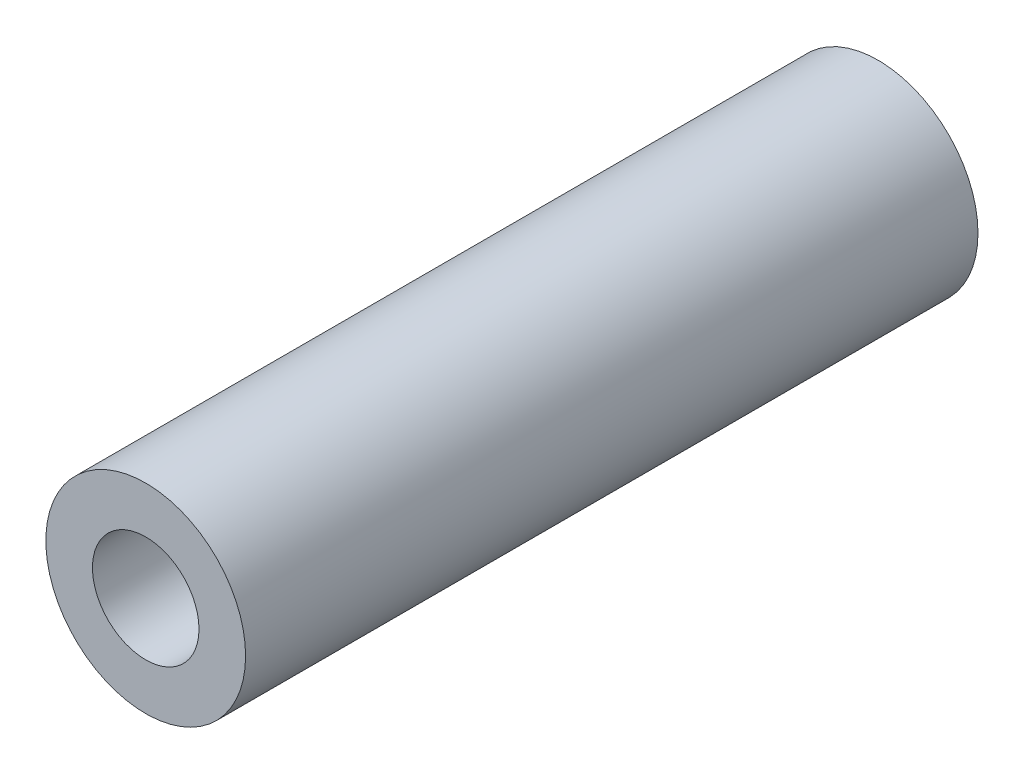
ISO-10303-21;
HEADER;
FILE_DESCRIPTION(('STEP AP214'),'2;1');
FILE_NAME('part.step','',(''),(''),'','','');
FILE_SCHEMA(('AUTOMOTIVE_DESIGN { 1 0 10303 214 1 1 1 1 }'));
ENDSEC;
DATA;
#1=APPLICATION_CONTEXT('core data for automotive mechanical design processes');
#2=APPLICATION_PROTOCOL_DEFINITION('international standard','automotive_design',2000,#1);
#3=PRODUCT_CONTEXT('',#1,'mechanical');
#4=PRODUCT('Part','Part','',(#3));
#5=PRODUCT_RELATED_PRODUCT_CATEGORY('part','',(#4));
#6=PRODUCT_DEFINITION_FORMATION('','',#4);
#7=PRODUCT_DEFINITION_CONTEXT('part definition',#1,'design');
#8=PRODUCT_DEFINITION('design','',#6,#7);
#9=PRODUCT_DEFINITION_SHAPE('','',#8);
#10=(LENGTH_UNIT() NAMED_UNIT(*) SI_UNIT(.MILLI.,.METRE.));
#11=(NAMED_UNIT(*) PLANE_ANGLE_UNIT() SI_UNIT($,.RADIAN.));
#12=(NAMED_UNIT(*) SI_UNIT($,.STERADIAN.) SOLID_ANGLE_UNIT());
#13=UNCERTAINTY_MEASURE_WITH_UNIT(LENGTH_MEASURE(1.E-05),#10,'distance_accuracy_value','');
#14=(GEOMETRIC_REPRESENTATION_CONTEXT(3) GLOBAL_UNCERTAINTY_ASSIGNED_CONTEXT((#13)) GLOBAL_UNIT_ASSIGNED_CONTEXT((#10,
#11,#12)) REPRESENTATION_CONTEXT('',''));
#15=CARTESIAN_POINT('',(0.,0.,0.));
#16=DIRECTION('',(0.,0.,1.));
#17=DIRECTION('',(1.,0.,0.));
#18=AXIS2_PLACEMENT_3D('',#15,#16,#17);
#19=CARTESIAN_POINT('',(0.,0.,110.));
#20=DIRECTION('',(0.,0.,1.));
#21=DIRECTION('',(1.,0.,0.));
#22=AXIS2_PLACEMENT_3D('',#19,#20,#21);
#23=PLANE('',#22);
#24=CARTESIAN_POINT('',(0.,0.,110.));
#25=DIRECTION('',(0.,0.,1.));
#26=DIRECTION('',(1.,0.,0.));
#27=AXIS2_PLACEMENT_3D('',#24,#25,#26);
#28=CIRCLE('',#27,15.);
#29=CARTESIAN_POINT('',(15.,0.,110.));
#30=VERTEX_POINT('',#29);
#31=EDGE_CURVE('E10',#30,#30,#28,.T.);
#32=ORIENTED_EDGE('',*,*,#31,.T.);
#33=EDGE_LOOP('',(#32));
#34=FACE_BOUND('',#33,.T.);
#35=CARTESIAN_POINT('',(0.,0.,110.));
#36=DIRECTION('',(0.,0.,1.));
#37=DIRECTION('',(1.,0.,0.));
#38=AXIS2_PLACEMENT_3D('',#35,#36,#37);
#39=CIRCLE('',#38,8.);
#40=CARTESIAN_POINT('',(8.,0.,110.));
#41=VERTEX_POINT('',#40);
#42=EDGE_CURVE('E42',#41,#41,#39,.T.);
#43=ORIENTED_EDGE('',*,*,#42,.F.);
#44=EDGE_LOOP('',(#43));
#45=FACE_BOUND('',#44,.T.);
#46=ADVANCED_FACE('F31',(#34,#45),#23,.T.);
#47=CARTESIAN_POINT('',(0.,0.,0.));
#48=DIRECTION('',(0.,0.,1.));
#49=DIRECTION('',(1.,0.,0.));
#50=AXIS2_PLACEMENT_3D('',#47,#48,#49);
#51=PLANE('',#50);
#52=CARTESIAN_POINT('',(0.,0.,0.));
#53=DIRECTION('',(0.,0.,1.));
#54=DIRECTION('',(1.,0.,0.));
#55=AXIS2_PLACEMENT_3D('',#52,#53,#54);
#56=CIRCLE('',#55,15.);
#57=CARTESIAN_POINT('',(15.,0.,0.));
#58=VERTEX_POINT('',#57);
#59=EDGE_CURVE('E35',#58,#58,#56,.T.);
#60=ORIENTED_EDGE('',*,*,#59,.F.);
#61=EDGE_LOOP('',(#60));
#62=FACE_BOUND('',#61,.T.);
#63=CARTESIAN_POINT('',(0.,0.,0.));
#64=DIRECTION('',(0.,0.,1.));
#65=DIRECTION('',(1.,0.,0.));
#66=AXIS2_PLACEMENT_3D('',#63,#64,#65);
#67=CIRCLE('',#66,8.);
#68=CARTESIAN_POINT('',(8.,0.,0.));
#69=VERTEX_POINT('',#68);
#70=EDGE_CURVE('E44',#69,#69,#67,.T.);
#71=ORIENTED_EDGE('',*,*,#70,.T.);
#72=EDGE_LOOP('',(#71));
#73=FACE_BOUND('',#72,.T.);
#74=ADVANCED_FACE('F54',(#62,#73),#51,.F.);
#75=CARTESIAN_POINT('',(0.,0.,110.));
#76=DIRECTION('',(0.,0.,-1.));
#77=DIRECTION('',(-1.,0.,0.));
#78=AXIS2_PLACEMENT_3D('',#75,#76,#77);
#79=CYLINDRICAL_SURFACE('',#78,15.);
#80=ORIENTED_EDGE('',*,*,#31,.F.);
#81=EDGE_LOOP('',(#80));
#82=FACE_BOUND('',#81,.T.);
#83=ORIENTED_EDGE('',*,*,#59,.T.);
#84=EDGE_LOOP('',(#83));
#85=FACE_BOUND('',#84,.T.);
#86=ADVANCED_FACE('F33',(#82,#85),#79,.T.);
#87=CARTESIAN_POINT('',(0.,0.,110.));
#88=DIRECTION('',(0.,0.,-1.));
#89=DIRECTION('',(-1.,0.,0.));
#90=AXIS2_PLACEMENT_3D('',#87,#88,#89);
#91=CYLINDRICAL_SURFACE('',#90,8.);
#92=ORIENTED_EDGE('',*,*,#42,.T.);
#93=EDGE_LOOP('',(#92));
#94=FACE_BOUND('',#93,.T.);
#95=ORIENTED_EDGE('',*,*,#70,.F.);
#96=EDGE_LOOP('',(#95));
#97=FACE_BOUND('',#96,.T.);
#98=ADVANCED_FACE('F50',(#94,#97),#91,.F.);
#99=CLOSED_SHELL('',(#46,#74,#86,#98));
#100=MANIFOLD_SOLID_BREP('B2',#99);
#101=ADVANCED_BREP_SHAPE_REPRESENTATION('',(#18,#100),#14);
#102=SHAPE_DEFINITION_REPRESENTATION(#9,#101);
ENDSEC;
END-ISO-10303-21;
